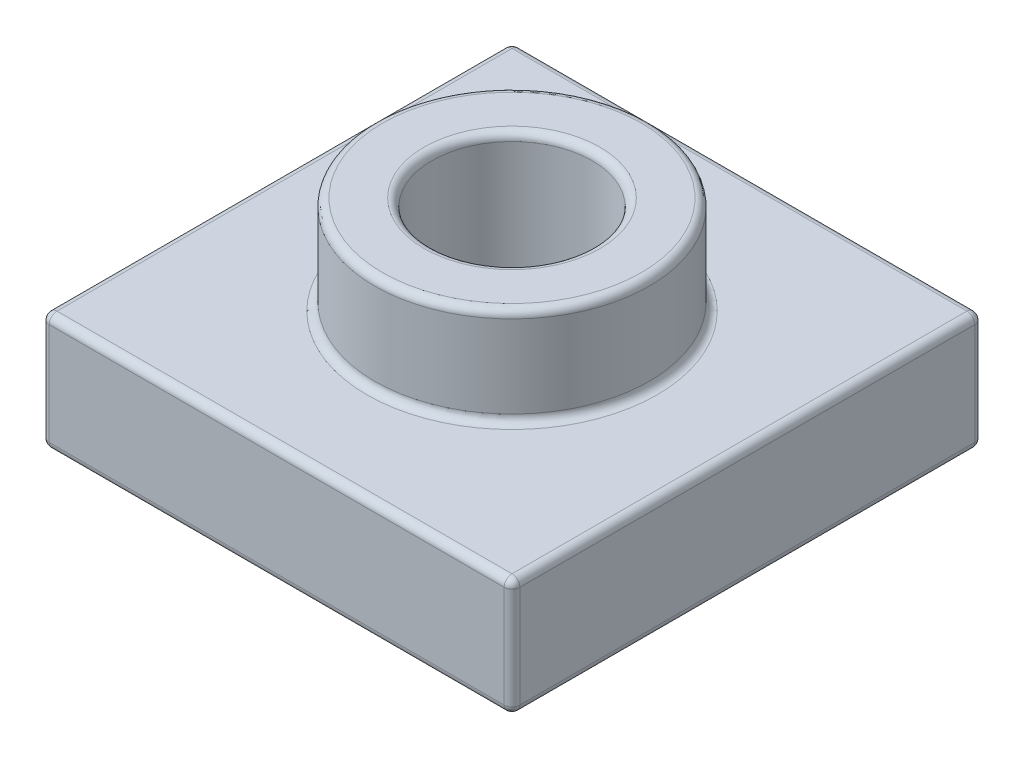
ISO-10303-21;
HEADER;
FILE_DESCRIPTION(('STEP AP214'),'2;1');
FILE_NAME('part.step','',(''),(''),'','','');
FILE_SCHEMA(('AUTOMOTIVE_DESIGN { 1 0 10303 214 1 1 1 1 }'));
ENDSEC;
DATA;
#1=APPLICATION_CONTEXT('core data for automotive mechanical design processes');
#2=APPLICATION_PROTOCOL_DEFINITION('international standard','automotive_design',2000,#1);
#3=PRODUCT_CONTEXT('',#1,'mechanical');
#4=PRODUCT('Part','Part','',(#3));
#5=PRODUCT_RELATED_PRODUCT_CATEGORY('part','',(#4));
#6=PRODUCT_DEFINITION_FORMATION('','',#4);
#7=PRODUCT_DEFINITION_CONTEXT('part definition',#1,'design');
#8=PRODUCT_DEFINITION('design','',#6,#7);
#9=PRODUCT_DEFINITION_SHAPE('','',#8);
#10=(LENGTH_UNIT() NAMED_UNIT(*) SI_UNIT(.MILLI.,.METRE.));
#11=(NAMED_UNIT(*) PLANE_ANGLE_UNIT() SI_UNIT($,.RADIAN.));
#12=(NAMED_UNIT(*) SI_UNIT($,.STERADIAN.) SOLID_ANGLE_UNIT());
#13=UNCERTAINTY_MEASURE_WITH_UNIT(LENGTH_MEASURE(1.E-05),#10,'distance_accuracy_value','');
#14=(GEOMETRIC_REPRESENTATION_CONTEXT(3) GLOBAL_UNCERTAINTY_ASSIGNED_CONTEXT((#13)) GLOBAL_UNIT_ASSIGNED_CONTEXT((#10,
#11,#12)) REPRESENTATION_CONTEXT('',''));
#15=CARTESIAN_POINT('',(0.,0.,0.));
#16=DIRECTION('',(0.,0.,1.));
#17=DIRECTION('',(1.,0.,0.));
#18=AXIS2_PLACEMENT_3D('',#15,#16,#17);
#19=CARTESIAN_POINT('',(60.,30.,-60.));
#20=DIRECTION('',(-1.,0.,0.));
#21=DIRECTION('',(0.,0.,1.));
#22=AXIS2_PLACEMENT_3D('',#19,#20,#21);
#23=PLANE('',#22);
#24=DIRECTION('',(0.,0.,-1.));
#25=VECTOR('',#24,1.);
#26=CARTESIAN_POINT('',(60.,2.,-60.));
#27=LINE('',#26,#25);
#28=CARTESIAN_POINT('',(60.,2.,58.));
#29=VERTEX_POINT('',#28);
#30=CARTESIAN_POINT('',(60.,2.,-58.));
#31=VERTEX_POINT('',#30);
#32=EDGE_CURVE('E219',#29,#31,#27,.T.);
#33=ORIENTED_EDGE('',*,*,#32,.T.);
#34=DIRECTION('',(0.,-1.,0.));
#35=VECTOR('',#34,1.);
#36=CARTESIAN_POINT('',(60.,30.,-58.));
#37=LINE('',#36,#35);
#38=CARTESIAN_POINT('',(60.,28.,-58.));
#39=VERTEX_POINT('',#38);
#40=EDGE_CURVE('E222',#31,#39,#37,.F.);
#41=ORIENTED_EDGE('',*,*,#40,.T.);
#42=DIRECTION('',(0.,0.,-1.));
#43=VECTOR('',#42,1.);
#44=CARTESIAN_POINT('',(60.,28.,60.));
#45=LINE('',#44,#43);
#46=CARTESIAN_POINT('',(60.,28.,58.));
#47=VERTEX_POINT('',#46);
#48=EDGE_CURVE('E217',#39,#47,#45,.F.);
#49=ORIENTED_EDGE('',*,*,#48,.T.);
#50=DIRECTION('',(0.,-1.,0.));
#51=VECTOR('',#50,1.);
#52=CARTESIAN_POINT('',(60.,30.,58.));
#53=LINE('',#52,#51);
#54=EDGE_CURVE('E215',#47,#29,#53,.T.);
#55=ORIENTED_EDGE('',*,*,#54,.T.);
#56=EDGE_LOOP('',(#33,#41,#49,#55));
#57=FACE_BOUND('',#56,.T.);
#58=ADVANCED_FACE('F33',(#57),#23,.F.);
#59=CARTESIAN_POINT('',(-60.,30.,-60.));
#60=DIRECTION('',(0.,0.,1.));
#61=DIRECTION('',(1.,0.,0.));
#62=AXIS2_PLACEMENT_3D('',#59,#60,#61);
#63=PLANE('',#62);
#64=DIRECTION('',(-1.,0.,0.));
#65=VECTOR('',#64,1.);
#66=CARTESIAN_POINT('',(60.,28.,-60.));
#67=LINE('',#66,#65);
#68=CARTESIAN_POINT('',(-58.,28.,-60.));
#69=VERTEX_POINT('',#68);
#70=CARTESIAN_POINT('',(58.,28.,-60.));
#71=VERTEX_POINT('',#70);
#72=EDGE_CURVE('E182',#69,#71,#67,.F.);
#73=ORIENTED_EDGE('',*,*,#72,.T.);
#74=DIRECTION('',(0.,-1.,0.));
#75=VECTOR('',#74,1.);
#76=CARTESIAN_POINT('',(58.,30.,-60.));
#77=LINE('',#76,#75);
#78=CARTESIAN_POINT('',(58.,2.,-60.));
#79=VERTEX_POINT('',#78);
#80=EDGE_CURVE('E187',#71,#79,#77,.T.);
#81=ORIENTED_EDGE('',*,*,#80,.T.);
#82=DIRECTION('',(-1.,0.,0.));
#83=VECTOR('',#82,1.);
#84=CARTESIAN_POINT('',(-60.,2.,-60.));
#85=LINE('',#84,#83);
#86=CARTESIAN_POINT('',(-58.,2.,-60.));
#87=VERTEX_POINT('',#86);
#88=EDGE_CURVE('E184',#79,#87,#85,.T.);
#89=ORIENTED_EDGE('',*,*,#88,.T.);
#90=DIRECTION('',(0.,-1.,0.));
#91=VECTOR('',#90,1.);
#92=CARTESIAN_POINT('',(-58.,30.,-60.));
#93=LINE('',#92,#91);
#94=EDGE_CURVE('E180',#87,#69,#93,.F.);
#95=ORIENTED_EDGE('',*,*,#94,.T.);
#96=EDGE_LOOP('',(#73,#81,#89,#95));
#97=FACE_BOUND('',#96,.T.);
#98=ADVANCED_FACE('F373',(#97),#63,.F.);
#99=CARTESIAN_POINT('',(-60.,30.,-60.));
#100=DIRECTION('',(1.,0.,0.));
#101=DIRECTION('',(0.,0.,-1.));
#102=AXIS2_PLACEMENT_3D('',#99,#100,#101);
#103=PLANE('',#102);
#104=DIRECTION('',(0.,0.,1.));
#105=VECTOR('',#104,1.);
#106=CARTESIAN_POINT('',(-60.,28.,-60.));
#107=LINE('',#106,#105);
#108=CARTESIAN_POINT('',(-60.,28.,58.));
#109=VERTEX_POINT('',#108);
#110=CARTESIAN_POINT('',(-60.,28.,-58.));
#111=VERTEX_POINT('',#110);
#112=EDGE_CURVE('E199',#109,#111,#107,.F.);
#113=ORIENTED_EDGE('',*,*,#112,.T.);
#114=DIRECTION('',(0.,-1.,0.));
#115=VECTOR('',#114,1.);
#116=CARTESIAN_POINT('',(-60.,30.,-58.));
#117=LINE('',#116,#115);
#118=CARTESIAN_POINT('',(-60.,2.,-58.));
#119=VERTEX_POINT('',#118);
#120=EDGE_CURVE('E204',#111,#119,#117,.T.);
#121=ORIENTED_EDGE('',*,*,#120,.T.);
#122=DIRECTION('',(0.,0.,1.));
#123=VECTOR('',#122,1.);
#124=CARTESIAN_POINT('',(-60.,2.,-60.));
#125=LINE('',#124,#123);
#126=CARTESIAN_POINT('',(-60.,2.,58.));
#127=VERTEX_POINT('',#126);
#128=EDGE_CURVE('E201',#119,#127,#125,.T.);
#129=ORIENTED_EDGE('',*,*,#128,.T.);
#130=DIRECTION('',(0.,-1.,0.));
#131=VECTOR('',#130,1.);
#132=CARTESIAN_POINT('',(-60.,30.,58.));
#133=LINE('',#132,#131);
#134=EDGE_CURVE('E197',#127,#109,#133,.F.);
#135=ORIENTED_EDGE('',*,*,#134,.T.);
#136=EDGE_LOOP('',(#113,#121,#129,#135));
#137=FACE_BOUND('',#136,.T.);
#138=ADVANCED_FACE('F385',(#137),#103,.F.);
#139=CARTESIAN_POINT('',(-60.,30.,60.));
#140=DIRECTION('',(0.,0.,-1.));
#141=DIRECTION('',(-1.,0.,0.));
#142=AXIS2_PLACEMENT_3D('',#139,#140,#141);
#143=PLANE('',#142);
#144=DIRECTION('',(1.,0.,0.));
#145=VECTOR('',#144,1.);
#146=CARTESIAN_POINT('',(-60.,2.,60.));
#147=LINE('',#146,#145);
#148=CARTESIAN_POINT('',(-58.,2.,60.));
#149=VERTEX_POINT('',#148);
#150=CARTESIAN_POINT('',(58.,2.,60.));
#151=VERTEX_POINT('',#150);
#152=EDGE_CURVE('E210',#149,#151,#147,.T.);
#153=ORIENTED_EDGE('',*,*,#152,.T.);
#154=DIRECTION('',(0.,-1.,0.));
#155=VECTOR('',#154,1.);
#156=CARTESIAN_POINT('',(58.,30.,60.));
#157=LINE('',#156,#155);
#158=CARTESIAN_POINT('',(58.,28.,60.));
#159=VERTEX_POINT('',#158);
#160=EDGE_CURVE('E213',#151,#159,#157,.F.);
#161=ORIENTED_EDGE('',*,*,#160,.T.);
#162=DIRECTION('',(1.,0.,0.));
#163=VECTOR('',#162,1.);
#164=CARTESIAN_POINT('',(-60.,28.,60.));
#165=LINE('',#164,#163);
#166=CARTESIAN_POINT('',(-58.,28.,60.));
#167=VERTEX_POINT('',#166);
#168=EDGE_CURVE('E208',#159,#167,#165,.F.);
#169=ORIENTED_EDGE('',*,*,#168,.T.);
#170=DIRECTION('',(0.,-1.,0.));
#171=VECTOR('',#170,1.);
#172=CARTESIAN_POINT('',(-58.,30.,60.));
#173=LINE('',#172,#171);
#174=EDGE_CURVE('E206',#167,#149,#173,.T.);
#175=ORIENTED_EDGE('',*,*,#174,.T.);
#176=EDGE_LOOP('',(#153,#161,#169,#175));
#177=FACE_BOUND('',#176,.T.);
#178=ADVANCED_FACE('F356',(#177),#143,.F.);
#179=CARTESIAN_POINT('',(0.,30.,0.));
#180=DIRECTION('',(0.,1.,0.));
#181=DIRECTION('',(0.,0.,1.));
#182=AXIS2_PLACEMENT_3D('',#179,#180,#181);
#183=PLANE('',#182);
#184=CARTESIAN_POINT('',(0.,30.,0.));
#185=DIRECTION('',(0.,1.,0.));
#186=DIRECTION('',(0.,0.,1.));
#187=AXIS2_PLACEMENT_3D('',#184,#185,#186);
#188=CIRCLE('',#187,37.);
#189=CARTESIAN_POINT('',(0.,30.,37.));
#190=VERTEX_POINT('',#189);
#191=EDGE_CURVE('E11',#190,#190,#188,.F.);
#192=ORIENTED_EDGE('',*,*,#191,.T.);
#193=EDGE_LOOP('',(#192));
#194=FACE_BOUND('',#193,.T.);
#195=DIRECTION('',(1.,0.,0.));
#196=VECTOR('',#195,1.);
#197=CARTESIAN_POINT('',(60.,30.,58.));
#198=LINE('',#197,#196);
#199=CARTESIAN_POINT('',(-58.,30.,58.));
#200=VERTEX_POINT('',#199);
#201=CARTESIAN_POINT('',(58.,30.,58.));
#202=VERTEX_POINT('',#201);
#203=EDGE_CURVE('E54',#200,#202,#198,.T.);
#204=ORIENTED_EDGE('',*,*,#203,.T.);
#205=DIRECTION('',(0.,0.,-1.));
#206=VECTOR('',#205,1.);
#207=CARTESIAN_POINT('',(58.,30.,-60.));
#208=LINE('',#207,#206);
#209=CARTESIAN_POINT('',(58.,30.,-58.));
#210=VERTEX_POINT('',#209);
#211=EDGE_CURVE('E42',#202,#210,#208,.T.);
#212=ORIENTED_EDGE('',*,*,#211,.T.);
#213=DIRECTION('',(-1.,0.,0.));
#214=VECTOR('',#213,1.);
#215=CARTESIAN_POINT('',(-60.,30.,-58.));
#216=LINE('',#215,#214);
#217=CARTESIAN_POINT('',(-58.,30.,-58.));
#218=VERTEX_POINT('',#217);
#219=EDGE_CURVE('E245',#210,#218,#216,.T.);
#220=ORIENTED_EDGE('',*,*,#219,.T.);
#221=DIRECTION('',(0.,0.,1.));
#222=VECTOR('',#221,1.);
#223=CARTESIAN_POINT('',(-58.,30.,60.));
#224=LINE('',#223,#222);
#225=EDGE_CURVE('E242',#218,#200,#224,.T.);
#226=ORIENTED_EDGE('',*,*,#225,.T.);
#227=EDGE_LOOP('',(#204,#212,#220,#226));
#228=FACE_BOUND('',#227,.T.);
#229=ADVANCED_FACE('F343',(#194,#228),#183,.T.);
#230=CARTESIAN_POINT('',(0.,55.,0.));
#231=DIRECTION('',(0.,-1.,0.));
#232=DIRECTION('',(0.,0.,-1.));
#233=AXIS2_PLACEMENT_3D('',#230,#231,#232);
#234=CYLINDRICAL_SURFACE('',#233,35.);
#235=CARTESIAN_POINT('',(0.,53.,0.));
#236=DIRECTION('',(0.,1.,0.));
#237=DIRECTION('',(0.,0.,1.));
#238=AXIS2_PLACEMENT_3D('',#235,#236,#237);
#239=CIRCLE('',#238,35.);
#240=CARTESIAN_POINT('',(0.,53.,35.));
#241=VERTEX_POINT('',#240);
#242=EDGE_CURVE('E239',#241,#241,#239,.F.);
#243=ORIENTED_EDGE('',*,*,#242,.T.);
#244=EDGE_LOOP('',(#243));
#245=FACE_BOUND('',#244,.T.);
#246=CARTESIAN_POINT('',(0.,32.,0.));
#247=DIRECTION('',(0.,1.,0.));
#248=DIRECTION('',(0.,0.,1.));
#249=AXIS2_PLACEMENT_3D('',#246,#247,#248);
#250=CIRCLE('',#249,35.);
#251=CARTESIAN_POINT('',(0.,32.,35.));
#252=VERTEX_POINT('',#251);
#253=EDGE_CURVE('E236',#252,#252,#250,.T.);
#254=ORIENTED_EDGE('',*,*,#253,.T.);
#255=EDGE_LOOP('',(#254));
#256=FACE_BOUND('',#255,.T.);
#257=ADVANCED_FACE('F692',(#245,#256),#234,.T.);
#258=CARTESIAN_POINT('',(0.,55.,0.));
#259=DIRECTION('',(0.,1.,0.));
#260=DIRECTION('',(0.,0.,1.));
#261=AXIS2_PLACEMENT_3D('',#258,#259,#260);
#262=PLANE('',#261);
#263=CARTESIAN_POINT('',(0.,55.,0.));
#264=DIRECTION('',(0.,1.,0.));
#265=DIRECTION('',(0.,0.,1.));
#266=AXIS2_PLACEMENT_3D('',#263,#264,#265);
#267=CIRCLE('',#266,33.);
#268=CARTESIAN_POINT('',(0.,55.,33.));
#269=VERTEX_POINT('',#268);
#270=EDGE_CURVE('E233',#269,#269,#267,.T.);
#271=ORIENTED_EDGE('',*,*,#270,.T.);
#272=EDGE_LOOP('',(#271));
#273=FACE_BOUND('',#272,.T.);
#274=CARTESIAN_POINT('',(0.,55.,0.));
#275=DIRECTION('',(0.,1.,0.));
#276=DIRECTION('',(0.,0.,1.));
#277=AXIS2_PLACEMENT_3D('',#274,#275,#276);
#278=CIRCLE('',#277,22.4252107322673);
#279=CARTESIAN_POINT('',(0.,55.,22.4252107322673));
#280=VERTEX_POINT('',#279);
#281=EDGE_CURVE('E230',#280,#280,#278,.F.);
#282=ORIENTED_EDGE('',*,*,#281,.T.);
#283=EDGE_LOOP('',(#282));
#284=FACE_BOUND('',#283,.T.);
#285=ADVANCED_FACE('F683',(#273,#284),#262,.T.);
#286=CARTESIAN_POINT('',(0.,0.,0.));
#287=DIRECTION('',(0.,1.,0.));
#288=DIRECTION('',(0.,0.,1.));
#289=AXIS2_PLACEMENT_3D('',#286,#287,#288);
#290=CYLINDRICAL_SURFACE('',#289,20.4252107322673);
#291=CARTESIAN_POINT('',(0.,2.,0.));
#292=DIRECTION('',(0.,1.,0.));
#293=DIRECTION('',(0.,0.,1.));
#294=AXIS2_PLACEMENT_3D('',#291,#292,#293);
#295=CIRCLE('',#294,20.4252107322673);
#296=CARTESIAN_POINT('',(0.,2.,20.4252107322673));
#297=VERTEX_POINT('',#296);
#298=EDGE_CURVE('E227',#297,#297,#295,.F.);
#299=ORIENTED_EDGE('',*,*,#298,.T.);
#300=EDGE_LOOP('',(#299));
#301=FACE_BOUND('',#300,.T.);
#302=CARTESIAN_POINT('',(0.,53.,0.));
#303=DIRECTION('',(0.,1.,0.));
#304=DIRECTION('',(0.,0.,1.));
#305=AXIS2_PLACEMENT_3D('',#302,#303,#304);
#306=CIRCLE('',#305,20.4252107322673);
#307=CARTESIAN_POINT('',(0.,53.,20.4252107322673));
#308=VERTEX_POINT('',#307);
#309=EDGE_CURVE('E224',#308,#308,#306,.T.);
#310=ORIENTED_EDGE('',*,*,#309,.T.);
#311=EDGE_LOOP('',(#310));
#312=FACE_BOUND('',#311,.T.);
#313=ADVANCED_FACE('F675',(#301,#312),#290,.F.);
#314=CARTESIAN_POINT('',(0.,28.,58.));
#315=DIRECTION('',(-1.,0.,0.));
#316=DIRECTION('',(0.,0.,1.));
#317=AXIS2_PLACEMENT_3D('',#314,#315,#316);
#318=CYLINDRICAL_SURFACE('',#317,2.);
#319=CARTESIAN_POINT('',(58.,28.,58.));
#320=DIRECTION('',(1.,0.,0.));
#321=DIRECTION('',(0.,0.,-1.));
#322=AXIS2_PLACEMENT_3D('',#319,#320,#321);
#323=CIRCLE('',#322,2.);
#324=EDGE_CURVE('E37',#202,#159,#323,.T.);
#325=ORIENTED_EDGE('',*,*,#324,.F.);
#326=ORIENTED_EDGE('',*,*,#203,.F.);
#327=CARTESIAN_POINT('',(-58.,28.,58.));
#328=DIRECTION('',(-1.,0.,0.));
#329=DIRECTION('',(0.,0.,1.));
#330=AXIS2_PLACEMENT_3D('',#327,#328,#329);
#331=CIRCLE('',#330,2.);
#332=EDGE_CURVE('E307',#167,#200,#331,.T.);
#333=ORIENTED_EDGE('',*,*,#332,.F.);
#334=ORIENTED_EDGE('',*,*,#168,.F.);
#335=EDGE_LOOP('',(#325,#326,#333,#334));
#336=FACE_BOUND('',#335,.T.);
#337=ADVANCED_FACE('F346',(#336),#318,.T.);
#338=CARTESIAN_POINT('',(58.,28.,58.));
#339=DIRECTION('',(0.,0.,1.));
#340=DIRECTION('',(1.,0.,0.));
#341=AXIS2_PLACEMENT_3D('',#338,#339,#340);
#342=SPHERICAL_SURFACE('',#341,2.);
#343=CARTESIAN_POINT('',(58.,28.,58.));
#344=DIRECTION('',(0.,0.,1.));
#345=DIRECTION('',(1.,0.,0.));
#346=AXIS2_PLACEMENT_3D('',#343,#344,#345);
#347=CIRCLE('',#346,2.);
#348=EDGE_CURVE('E302',#202,#47,#347,.F.);
#349=ORIENTED_EDGE('',*,*,#348,.F.);
#350=ORIENTED_EDGE('',*,*,#324,.T.);
#351=CARTESIAN_POINT('',(58.,28.,58.));
#352=DIRECTION('',(0.,1.,0.));
#353=DIRECTION('',(0.,0.,1.));
#354=AXIS2_PLACEMENT_3D('',#351,#352,#353);
#355=CIRCLE('',#354,2.);
#356=EDGE_CURVE('E305',#47,#159,#355,.F.);
#357=ORIENTED_EDGE('',*,*,#356,.F.);
#358=EDGE_LOOP('',(#349,#350,#357));
#359=FACE_BOUND('',#358,.T.);
#360=ADVANCED_FACE('F317',(#359),#342,.T.);
#361=CARTESIAN_POINT('',(-58.,28.,58.));
#362=DIRECTION('',(0.,0.,1.));
#363=DIRECTION('',(1.,0.,0.));
#364=AXIS2_PLACEMENT_3D('',#361,#362,#363);
#365=SPHERICAL_SURFACE('',#364,2.);
#366=CARTESIAN_POINT('',(-58.,28.,58.));
#367=DIRECTION('',(0.,1.,0.));
#368=DIRECTION('',(0.,0.,1.));
#369=AXIS2_PLACEMENT_3D('',#366,#367,#368);
#370=CIRCLE('',#369,2.);
#371=EDGE_CURVE('E296',#167,#109,#370,.F.);
#372=ORIENTED_EDGE('',*,*,#371,.F.);
#373=ORIENTED_EDGE('',*,*,#332,.T.);
#374=CARTESIAN_POINT('',(-58.,28.,58.));
#375=DIRECTION('',(0.,0.,1.));
#376=DIRECTION('',(1.,0.,0.));
#377=AXIS2_PLACEMENT_3D('',#374,#375,#376);
#378=CIRCLE('',#377,2.);
#379=EDGE_CURVE('E299',#109,#200,#378,.F.);
#380=ORIENTED_EDGE('',*,*,#379,.F.);
#381=EDGE_LOOP('',(#372,#373,#380));
#382=FACE_BOUND('',#381,.T.);
#383=ADVANCED_FACE('F348',(#382),#365,.T.);
#384=CARTESIAN_POINT('',(58.,30.,58.));
#385=DIRECTION('',(0.,-1.,0.));
#386=DIRECTION('',(0.,0.,-1.));
#387=AXIS2_PLACEMENT_3D('',#384,#385,#386);
#388=CYLINDRICAL_SURFACE('',#387,2.);
#389=ORIENTED_EDGE('',*,*,#356,.T.);
#390=ORIENTED_EDGE('',*,*,#160,.F.);
#391=CARTESIAN_POINT('',(58.,2.,58.));
#392=DIRECTION('',(0.,-1.,0.));
#393=DIRECTION('',(0.,0.,-1.));
#394=AXIS2_PLACEMENT_3D('',#391,#392,#393);
#395=CIRCLE('',#394,2.);
#396=EDGE_CURVE('E291',#29,#151,#395,.T.);
#397=ORIENTED_EDGE('',*,*,#396,.F.);
#398=ORIENTED_EDGE('',*,*,#54,.F.);
#399=EDGE_LOOP('',(#389,#390,#397,#398));
#400=FACE_BOUND('',#399,.T.);
#401=ADVANCED_FACE('F323',(#400),#388,.T.);
#402=CARTESIAN_POINT('',(58.,28.,0.));
#403=DIRECTION('',(0.,0.,1.));
#404=DIRECTION('',(1.,0.,0.));
#405=AXIS2_PLACEMENT_3D('',#402,#403,#404);
#406=CYLINDRICAL_SURFACE('',#405,2.);
#407=ORIENTED_EDGE('',*,*,#348,.T.);
#408=ORIENTED_EDGE('',*,*,#48,.F.);
#409=CARTESIAN_POINT('',(58.,28.,-58.));
#410=DIRECTION('',(0.,0.,-1.));
#411=DIRECTION('',(-1.,0.,0.));
#412=AXIS2_PLACEMENT_3D('',#409,#410,#411);
#413=CIRCLE('',#412,2.);
#414=EDGE_CURVE('E288',#210,#39,#413,.T.);
#415=ORIENTED_EDGE('',*,*,#414,.F.);
#416=ORIENTED_EDGE('',*,*,#211,.F.);
#417=EDGE_LOOP('',(#407,#408,#415,#416));
#418=FACE_BOUND('',#417,.T.);
#419=ADVANCED_FACE('F332',(#418),#406,.T.);
#420=CARTESIAN_POINT('',(0.,28.,-58.));
#421=DIRECTION('',(1.,0.,0.));
#422=DIRECTION('',(0.,0.,-1.));
#423=AXIS2_PLACEMENT_3D('',#420,#421,#422);
#424=CYLINDRICAL_SURFACE('',#423,2.);
#425=CARTESIAN_POINT('',(-58.,28.,-58.));
#426=DIRECTION('',(-1.,0.,0.));
#427=DIRECTION('',(0.,0.,1.));
#428=AXIS2_PLACEMENT_3D('',#425,#426,#427);
#429=CIRCLE('',#428,2.);
#430=EDGE_CURVE('E282',#218,#69,#429,.T.);
#431=ORIENTED_EDGE('',*,*,#430,.F.);
#432=ORIENTED_EDGE('',*,*,#219,.F.);
#433=CARTESIAN_POINT('',(58.,28.,-58.));
#434=DIRECTION('',(1.,0.,0.));
#435=DIRECTION('',(0.,0.,-1.));
#436=AXIS2_PLACEMENT_3D('',#433,#434,#435);
#437=CIRCLE('',#436,2.);
#438=EDGE_CURVE('E285',#71,#210,#437,.T.);
#439=ORIENTED_EDGE('',*,*,#438,.F.);
#440=ORIENTED_EDGE('',*,*,#72,.F.);
#441=EDGE_LOOP('',(#431,#432,#439,#440));
#442=FACE_BOUND('',#441,.T.);
#443=ADVANCED_FACE('F341',(#442),#424,.T.);
#444=CARTESIAN_POINT('',(-58.,28.,0.));
#445=DIRECTION('',(0.,0.,-1.));
#446=DIRECTION('',(-1.,0.,0.));
#447=AXIS2_PLACEMENT_3D('',#444,#445,#446);
#448=CYLINDRICAL_SURFACE('',#447,2.);
#449=ORIENTED_EDGE('',*,*,#379,.T.);
#450=ORIENTED_EDGE('',*,*,#225,.F.);
#451=CARTESIAN_POINT('',(-58.,28.,-58.));
#452=DIRECTION('',(0.,0.,-1.));
#453=DIRECTION('',(-1.,0.,0.));
#454=AXIS2_PLACEMENT_3D('',#451,#452,#453);
#455=CIRCLE('',#454,2.);
#456=EDGE_CURVE('E280',#111,#218,#455,.T.);
#457=ORIENTED_EDGE('',*,*,#456,.F.);
#458=ORIENTED_EDGE('',*,*,#112,.F.);
#459=EDGE_LOOP('',(#449,#450,#457,#458));
#460=FACE_BOUND('',#459,.T.);
#461=ADVANCED_FACE('F383',(#460),#448,.T.);
#462=CARTESIAN_POINT('',(-58.,30.,58.));
#463=DIRECTION('',(0.,-1.,0.));
#464=DIRECTION('',(0.,0.,-1.));
#465=AXIS2_PLACEMENT_3D('',#462,#463,#464);
#466=CYLINDRICAL_SURFACE('',#465,2.);
#467=ORIENTED_EDGE('',*,*,#371,.T.);
#468=ORIENTED_EDGE('',*,*,#134,.F.);
#469=CARTESIAN_POINT('',(-58.,2.,58.));
#470=DIRECTION('',(0.,-1.,0.));
#471=DIRECTION('',(0.,0.,-1.));
#472=AXIS2_PLACEMENT_3D('',#469,#470,#471);
#473=CIRCLE('',#472,2.);
#474=EDGE_CURVE('E277',#149,#127,#473,.T.);
#475=ORIENTED_EDGE('',*,*,#474,.F.);
#476=ORIENTED_EDGE('',*,*,#174,.F.);
#477=EDGE_LOOP('',(#467,#468,#475,#476));
#478=FACE_BOUND('',#477,.T.);
#479=ADVANCED_FACE('F353',(#478),#466,.T.);
#480=CARTESIAN_POINT('',(-60.,2.,58.));
#481=DIRECTION('',(1.,0.,0.));
#482=DIRECTION('',(0.,0.,-1.));
#483=AXIS2_PLACEMENT_3D('',#480,#481,#482);
#484=CYLINDRICAL_SURFACE('',#483,2.);
#485=CARTESIAN_POINT('',(58.,2.,58.));
#486=DIRECTION('',(1.,0.,0.));
#487=DIRECTION('',(0.,0.,-1.));
#488=AXIS2_PLACEMENT_3D('',#485,#486,#487);
#489=CIRCLE('',#488,2.);
#490=CARTESIAN_POINT('',(58.,0.,58.));
#491=VERTEX_POINT('',#490);
#492=EDGE_CURVE('E293',#151,#491,#489,.T.);
#493=ORIENTED_EDGE('',*,*,#492,.F.);
#494=ORIENTED_EDGE('',*,*,#152,.F.);
#495=CARTESIAN_POINT('',(-58.,2.,58.));
#496=DIRECTION('',(-1.,0.,0.));
#497=DIRECTION('',(0.,0.,1.));
#498=AXIS2_PLACEMENT_3D('',#495,#496,#497);
#499=CIRCLE('',#498,2.);
#500=CARTESIAN_POINT('',(-58.,0.,58.));
#501=VERTEX_POINT('',#500);
#502=EDGE_CURVE('E274',#501,#149,#499,.T.);
#503=ORIENTED_EDGE('',*,*,#502,.F.);
#504=DIRECTION('',(1.,0.,0.));
#505=VECTOR('',#504,1.);
#506=CARTESIAN_POINT('',(0.,0.,58.));
#507=LINE('',#506,#505);
#508=EDGE_CURVE('E190',#491,#501,#507,.F.);
#509=ORIENTED_EDGE('',*,*,#508,.F.);
#510=EDGE_LOOP('',(#493,#494,#503,#509));
#511=FACE_BOUND('',#510,.T.);
#512=ADVANCED_FACE('F360',(#511),#484,.T.);
#513=CARTESIAN_POINT('',(58.,2.,58.));
#514=DIRECTION('',(0.,0.,1.));
#515=DIRECTION('',(1.,0.,0.));
#516=AXIS2_PLACEMENT_3D('',#513,#514,#515);
#517=SPHERICAL_SURFACE('',#516,2.);
#518=ORIENTED_EDGE('',*,*,#396,.T.);
#519=ORIENTED_EDGE('',*,*,#492,.T.);
#520=CARTESIAN_POINT('',(58.,2.,58.));
#521=DIRECTION('',(0.,0.,1.));
#522=DIRECTION('',(1.,0.,0.));
#523=AXIS2_PLACEMENT_3D('',#520,#521,#522);
#524=CIRCLE('',#523,2.);
#525=EDGE_CURVE('E271',#29,#491,#524,.F.);
#526=ORIENTED_EDGE('',*,*,#525,.F.);
#527=EDGE_LOOP('',(#518,#519,#526));
#528=FACE_BOUND('',#527,.T.);
#529=ADVANCED_FACE('F363',(#528),#517,.T.);
#530=CARTESIAN_POINT('',(58.,28.,-58.));
#531=DIRECTION('',(0.,0.,1.));
#532=DIRECTION('',(1.,0.,0.));
#533=AXIS2_PLACEMENT_3D('',#530,#531,#532);
#534=SPHERICAL_SURFACE('',#533,2.);
#535=ORIENTED_EDGE('',*,*,#438,.T.);
#536=ORIENTED_EDGE('',*,*,#414,.T.);
#537=CARTESIAN_POINT('',(58.,28.,-58.));
#538=DIRECTION('',(0.,1.,0.));
#539=DIRECTION('',(0.,0.,1.));
#540=AXIS2_PLACEMENT_3D('',#537,#538,#539);
#541=CIRCLE('',#540,2.);
#542=EDGE_CURVE('E268',#71,#39,#541,.F.);
#543=ORIENTED_EDGE('',*,*,#542,.F.);
#544=EDGE_LOOP('',(#535,#536,#543));
#545=FACE_BOUND('',#544,.T.);
#546=ADVANCED_FACE('F336',(#545),#534,.T.);
#547=CARTESIAN_POINT('',(-58.,28.,-58.));
#548=DIRECTION('',(0.,0.,1.));
#549=DIRECTION('',(1.,0.,0.));
#550=AXIS2_PLACEMENT_3D('',#547,#548,#549);
#551=SPHERICAL_SURFACE('',#550,2.);
#552=ORIENTED_EDGE('',*,*,#456,.T.);
#553=ORIENTED_EDGE('',*,*,#430,.T.);
#554=CARTESIAN_POINT('',(-58.,28.,-58.));
#555=DIRECTION('',(0.,1.,0.));
#556=DIRECTION('',(0.,0.,1.));
#557=AXIS2_PLACEMENT_3D('',#554,#555,#556);
#558=CIRCLE('',#557,2.);
#559=EDGE_CURVE('E265',#111,#69,#558,.F.);
#560=ORIENTED_EDGE('',*,*,#559,.F.);
#561=EDGE_LOOP('',(#552,#553,#560));
#562=FACE_BOUND('',#561,.T.);
#563=ADVANCED_FACE('F382',(#562),#551,.T.);
#564=CARTESIAN_POINT('',(-58.,2.,58.));
#565=DIRECTION('',(0.,0.,1.));
#566=DIRECTION('',(1.,0.,0.));
#567=AXIS2_PLACEMENT_3D('',#564,#565,#566);
#568=SPHERICAL_SURFACE('',#567,2.);
#569=ORIENTED_EDGE('',*,*,#502,.T.);
#570=ORIENTED_EDGE('',*,*,#474,.T.);
#571=CARTESIAN_POINT('',(-58.,2.,58.));
#572=DIRECTION('',(0.,0.,1.));
#573=DIRECTION('',(1.,0.,0.));
#574=AXIS2_PLACEMENT_3D('',#571,#572,#573);
#575=CIRCLE('',#574,2.);
#576=EDGE_CURVE('E263',#501,#127,#575,.F.);
#577=ORIENTED_EDGE('',*,*,#576,.F.);
#578=EDGE_LOOP('',(#569,#570,#577));
#579=FACE_BOUND('',#578,.T.);
#580=ADVANCED_FACE('F393',(#579),#568,.T.);
#581=CARTESIAN_POINT('',(58.,2.,-60.));
#582=DIRECTION('',(0.,0.,-1.));
#583=DIRECTION('',(-1.,0.,0.));
#584=AXIS2_PLACEMENT_3D('',#581,#582,#583);
#585=CYLINDRICAL_SURFACE('',#584,2.);
#586=ORIENTED_EDGE('',*,*,#525,.T.);
#587=DIRECTION('',(0.,0.,-1.));
#588=VECTOR('',#587,1.);
#589=CARTESIAN_POINT('',(58.,0.,0.));
#590=LINE('',#589,#588);
#591=CARTESIAN_POINT('',(58.,0.,-58.));
#592=VERTEX_POINT('',#591);
#593=EDGE_CURVE('E150',#592,#491,#590,.F.);
#594=ORIENTED_EDGE('',*,*,#593,.F.);
#595=CARTESIAN_POINT('',(58.,2.,-58.));
#596=DIRECTION('',(0.,0.,-1.));
#597=DIRECTION('',(-1.,0.,0.));
#598=AXIS2_PLACEMENT_3D('',#595,#596,#597);
#599=CIRCLE('',#598,2.);
#600=EDGE_CURVE('E260',#31,#592,#599,.T.);
#601=ORIENTED_EDGE('',*,*,#600,.F.);
#602=ORIENTED_EDGE('',*,*,#32,.F.);
#603=EDGE_LOOP('',(#586,#594,#601,#602));
#604=FACE_BOUND('',#603,.T.);
#605=ADVANCED_FACE('F365',(#604),#585,.T.);
#606=CARTESIAN_POINT('',(58.,30.,-58.));
#607=DIRECTION('',(0.,-1.,0.));
#608=DIRECTION('',(0.,0.,-1.));
#609=AXIS2_PLACEMENT_3D('',#606,#607,#608);
#610=CYLINDRICAL_SURFACE('',#609,2.);
#611=ORIENTED_EDGE('',*,*,#542,.T.);
#612=ORIENTED_EDGE('',*,*,#40,.F.);
#613=CARTESIAN_POINT('',(58.,2.,-58.));
#614=DIRECTION('',(0.,-1.,0.));
#615=DIRECTION('',(0.,0.,-1.));
#616=AXIS2_PLACEMENT_3D('',#613,#614,#615);
#617=CIRCLE('',#616,2.);
#618=EDGE_CURVE('E258',#79,#31,#617,.T.);
#619=ORIENTED_EDGE('',*,*,#618,.F.);
#620=ORIENTED_EDGE('',*,*,#80,.F.);
#621=EDGE_LOOP('',(#611,#612,#619,#620));
#622=FACE_BOUND('',#621,.T.);
#623=ADVANCED_FACE('F371',(#622),#610,.T.);
#624=CARTESIAN_POINT('',(-58.,30.,-58.));
#625=DIRECTION('',(0.,-1.,0.));
#626=DIRECTION('',(0.,0.,-1.));
#627=AXIS2_PLACEMENT_3D('',#624,#625,#626);
#628=CYLINDRICAL_SURFACE('',#627,2.);
#629=ORIENTED_EDGE('',*,*,#559,.T.);
#630=ORIENTED_EDGE('',*,*,#94,.F.);
#631=CARTESIAN_POINT('',(-58.,2.,-58.));
#632=DIRECTION('',(0.,-1.,0.));
#633=DIRECTION('',(0.,0.,-1.));
#634=AXIS2_PLACEMENT_3D('',#631,#632,#633);
#635=CIRCLE('',#634,2.);
#636=EDGE_CURVE('E255',#119,#87,#635,.T.);
#637=ORIENTED_EDGE('',*,*,#636,.F.);
#638=ORIENTED_EDGE('',*,*,#120,.F.);
#639=EDGE_LOOP('',(#629,#630,#637,#638));
#640=FACE_BOUND('',#639,.T.);
#641=ADVANCED_FACE('F378',(#640),#628,.T.);
#642=CARTESIAN_POINT('',(-58.,2.,-60.));
#643=DIRECTION('',(0.,0.,1.));
#644=DIRECTION('',(1.,0.,0.));
#645=AXIS2_PLACEMENT_3D('',#642,#643,#644);
#646=CYLINDRICAL_SURFACE('',#645,2.);
#647=ORIENTED_EDGE('',*,*,#576,.T.);
#648=ORIENTED_EDGE('',*,*,#128,.F.);
#649=CARTESIAN_POINT('',(-58.,2.,-58.));
#650=DIRECTION('',(0.,0.,-1.));
#651=DIRECTION('',(-1.,0.,0.));
#652=AXIS2_PLACEMENT_3D('',#649,#650,#651);
#653=CIRCLE('',#652,2.);
#654=CARTESIAN_POINT('',(-58.,0.,-58.));
#655=VERTEX_POINT('',#654);
#656=EDGE_CURVE('E252',#655,#119,#653,.T.);
#657=ORIENTED_EDGE('',*,*,#656,.F.);
#658=DIRECTION('',(0.,0.,1.));
#659=VECTOR('',#658,1.);
#660=CARTESIAN_POINT('',(-58.,0.,0.));
#661=LINE('',#660,#659);
#662=EDGE_CURVE('E192',#501,#655,#661,.F.);
#663=ORIENTED_EDGE('',*,*,#662,.F.);
#664=EDGE_LOOP('',(#647,#648,#657,#663));
#665=FACE_BOUND('',#664,.T.);
#666=ADVANCED_FACE('F389',(#665),#646,.T.);
#667=CARTESIAN_POINT('',(58.,2.,-58.));
#668=DIRECTION('',(0.,0.,1.));
#669=DIRECTION('',(1.,0.,0.));
#670=AXIS2_PLACEMENT_3D('',#667,#668,#669);
#671=SPHERICAL_SURFACE('',#670,2.);
#672=ORIENTED_EDGE('',*,*,#618,.T.);
#673=ORIENTED_EDGE('',*,*,#600,.T.);
#674=CARTESIAN_POINT('',(58.,2.,-58.));
#675=DIRECTION('',(1.,0.,0.));
#676=DIRECTION('',(0.,0.,-1.));
#677=AXIS2_PLACEMENT_3D('',#674,#675,#676);
#678=CIRCLE('',#677,2.);
#679=EDGE_CURVE('E249',#79,#592,#678,.F.);
#680=ORIENTED_EDGE('',*,*,#679,.F.);
#681=EDGE_LOOP('',(#672,#673,#680));
#682=FACE_BOUND('',#681,.T.);
#683=ADVANCED_FACE('F418',(#682),#671,.T.);
#684=CARTESIAN_POINT('',(-58.,2.,-58.));
#685=DIRECTION('',(0.,0.,1.));
#686=DIRECTION('',(1.,0.,0.));
#687=AXIS2_PLACEMENT_3D('',#684,#685,#686);
#688=SPHERICAL_SURFACE('',#687,2.);
#689=ORIENTED_EDGE('',*,*,#656,.T.);
#690=ORIENTED_EDGE('',*,*,#636,.T.);
#691=CARTESIAN_POINT('',(-58.,2.,-58.));
#692=DIRECTION('',(-1.,0.,0.));
#693=DIRECTION('',(0.,0.,1.));
#694=AXIS2_PLACEMENT_3D('',#691,#692,#693);
#695=CIRCLE('',#694,2.);
#696=EDGE_CURVE('E179',#655,#87,#695,.F.);
#697=ORIENTED_EDGE('',*,*,#696,.F.);
#698=EDGE_LOOP('',(#689,#690,#697));
#699=FACE_BOUND('',#698,.T.);
#700=ADVANCED_FACE('F414',(#699),#688,.T.);
#701=CARTESIAN_POINT('',(-60.,2.,-58.));
#702=DIRECTION('',(-1.,0.,0.));
#703=DIRECTION('',(0.,0.,1.));
#704=AXIS2_PLACEMENT_3D('',#701,#702,#703);
#705=CYLINDRICAL_SURFACE('',#704,2.);
#706=ORIENTED_EDGE('',*,*,#679,.T.);
#707=DIRECTION('',(-1.,0.,0.));
#708=VECTOR('',#707,1.);
#709=CARTESIAN_POINT('',(0.,0.,-58.));
#710=LINE('',#709,#708);
#711=EDGE_CURVE('E194',#655,#592,#710,.F.);
#712=ORIENTED_EDGE('',*,*,#711,.F.);
#713=ORIENTED_EDGE('',*,*,#696,.T.);
#714=ORIENTED_EDGE('',*,*,#88,.F.);
#715=EDGE_LOOP('',(#706,#712,#713,#714));
#716=FACE_BOUND('',#715,.T.);
#717=ADVANCED_FACE('F410',(#716),#705,.T.);
#718=CARTESIAN_POINT('',(0.,2.,0.));
#719=DIRECTION('',(0.,1.,0.));
#720=DIRECTION('',(0.,0.,1.));
#721=AXIS2_PLACEMENT_3D('',#718,#719,#720);
#722=TOROIDAL_SURFACE('',#721,22.4252107322673,2.);
#723=ORIENTED_EDGE('',*,*,#298,.F.);
#724=EDGE_LOOP('',(#723));
#725=FACE_BOUND('',#724,.T.);
#726=CARTESIAN_POINT('',(0.,0.,0.));
#727=DIRECTION('',(0.,1.,0.));
#728=DIRECTION('',(0.,0.,1.));
#729=AXIS2_PLACEMENT_3D('',#726,#727,#728);
#730=CIRCLE('',#729,22.4252107322673);
#731=CARTESIAN_POINT('',(0.,0.,22.4252107322673));
#732=VERTEX_POINT('',#731);
#733=EDGE_CURVE('E168',#732,#732,#730,.T.);
#734=ORIENTED_EDGE('',*,*,#733,.F.);
#735=EDGE_LOOP('',(#734));
#736=FACE_BOUND('',#735,.T.);
#737=ADVANCED_FACE('F413',(#725,#736),#722,.T.);
#738=CARTESIAN_POINT('',(0.,53.,0.));
#739=DIRECTION('',(0.,1.,0.));
#740=DIRECTION('',(0.,0.,1.));
#741=AXIS2_PLACEMENT_3D('',#738,#739,#740);
#742=TOROIDAL_SURFACE('',#741,33.,2.);
#743=ORIENTED_EDGE('',*,*,#242,.F.);
#744=EDGE_LOOP('',(#743));
#745=FACE_BOUND('',#744,.T.);
#746=ORIENTED_EDGE('',*,*,#270,.F.);
#747=EDGE_LOOP('',(#746));
#748=FACE_BOUND('',#747,.T.);
#749=ADVANCED_FACE('F459',(#745,#748),#742,.T.);
#750=CARTESIAN_POINT('',(0.,53.,0.));
#751=DIRECTION('',(0.,1.,0.));
#752=DIRECTION('',(0.,0.,1.));
#753=AXIS2_PLACEMENT_3D('',#750,#751,#752);
#754=TOROIDAL_SURFACE('',#753,22.4252107322673,2.);
#755=ORIENTED_EDGE('',*,*,#281,.F.);
#756=EDGE_LOOP('',(#755));
#757=FACE_BOUND('',#756,.T.);
#758=ORIENTED_EDGE('',*,*,#309,.F.);
#759=EDGE_LOOP('',(#758));
#760=FACE_BOUND('',#759,.T.);
#761=ADVANCED_FACE('F467',(#757,#760),#754,.T.);
#762=CARTESIAN_POINT('',(0.,32.,0.));
#763=DIRECTION('',(0.,1.,0.));
#764=DIRECTION('',(0.,0.,1.));
#765=AXIS2_PLACEMENT_3D('',#762,#763,#764);
#766=TOROIDAL_SURFACE('',#765,37.,2.);
#767=ORIENTED_EDGE('',*,*,#191,.F.);
#768=EDGE_LOOP('',(#767));
#769=FACE_BOUND('',#768,.T.);
#770=ORIENTED_EDGE('',*,*,#253,.F.);
#771=EDGE_LOOP('',(#770));
#772=FACE_BOUND('',#771,.T.);
#773=ADVANCED_FACE('F35',(#769,#772),#766,.F.);
#774=CARTESIAN_POINT('',(58.,30.,-60.));
#775=DIRECTION('',(-1.,0.,0.));
#776=DIRECTION('',(0.,0.,1.));
#777=AXIS2_PLACEMENT_3D('',#774,#775,#776);
#778=PLANE('',#777);
#779=ORIENTED_EDGE('',*,*,#593,.T.);
#780=DIRECTION('',(0.,1.,0.));
#781=VECTOR('',#780,1.);
#782=CARTESIAN_POINT('',(58.,30.,58.));
#783=LINE('',#782,#781);
#784=CARTESIAN_POINT('',(58.,28.,58.));
#785=VERTEX_POINT('',#784);
#786=EDGE_CURVE('E145',#491,#785,#783,.T.);
#787=ORIENTED_EDGE('',*,*,#786,.T.);
#788=DIRECTION('',(0.,0.,1.));
#789=VECTOR('',#788,1.);
#790=CARTESIAN_POINT('',(58.,28.,0.));
#791=LINE('',#790,#789);
#792=CARTESIAN_POINT('',(58.,28.,-58.));
#793=VERTEX_POINT('',#792);
#794=EDGE_CURVE('E135',#793,#785,#791,.T.);
#795=ORIENTED_EDGE('',*,*,#794,.F.);
#796=DIRECTION('',(0.,1.,0.));
#797=VECTOR('',#796,1.);
#798=CARTESIAN_POINT('',(58.,30.,-58.));
#799=LINE('',#798,#797);
#800=EDGE_CURVE('E144',#592,#793,#799,.T.);
#801=ORIENTED_EDGE('',*,*,#800,.F.);
#802=EDGE_LOOP('',(#779,#787,#795,#801));
#803=FACE_BOUND('',#802,.T.);
#804=ADVANCED_FACE('F148',(#803),#778,.T.);
#805=CARTESIAN_POINT('',(-60.,30.,-58.));
#806=DIRECTION('',(0.,0.,1.));
#807=DIRECTION('',(1.,0.,0.));
#808=AXIS2_PLACEMENT_3D('',#805,#806,#807);
#809=PLANE('',#808);
#810=DIRECTION('',(-1.,0.,0.));
#811=VECTOR('',#810,1.);
#812=CARTESIAN_POINT('',(-60.,28.,-58.));
#813=LINE('',#812,#811);
#814=CARTESIAN_POINT('',(-58.,28.,-58.));
#815=VERTEX_POINT('',#814);
#816=EDGE_CURVE('E141',#793,#815,#813,.T.);
#817=ORIENTED_EDGE('',*,*,#816,.T.);
#818=DIRECTION('',(0.,1.,0.));
#819=VECTOR('',#818,1.);
#820=CARTESIAN_POINT('',(-58.,30.,-58.));
#821=LINE('',#820,#819);
#822=EDGE_CURVE('E777',#655,#815,#821,.T.);
#823=ORIENTED_EDGE('',*,*,#822,.F.);
#824=ORIENTED_EDGE('',*,*,#711,.T.);
#825=ORIENTED_EDGE('',*,*,#800,.T.);
#826=EDGE_LOOP('',(#817,#823,#824,#825));
#827=FACE_BOUND('',#826,.T.);
#828=ADVANCED_FACE('F487',(#827),#809,.T.);
#829=CARTESIAN_POINT('',(-58.,30.,-60.));
#830=DIRECTION('',(1.,0.,0.));
#831=DIRECTION('',(0.,0.,-1.));
#832=AXIS2_PLACEMENT_3D('',#829,#830,#831);
#833=PLANE('',#832);
#834=DIRECTION('',(0.,0.,1.));
#835=VECTOR('',#834,1.);
#836=CARTESIAN_POINT('',(-58.,28.,-60.));
#837=LINE('',#836,#835);
#838=CARTESIAN_POINT('',(-58.,28.,58.));
#839=VERTEX_POINT('',#838);
#840=EDGE_CURVE('E158',#815,#839,#837,.T.);
#841=ORIENTED_EDGE('',*,*,#840,.T.);
#842=DIRECTION('',(0.,1.,0.));
#843=VECTOR('',#842,1.);
#844=CARTESIAN_POINT('',(-58.,30.,58.));
#845=LINE('',#844,#843);
#846=EDGE_CURVE('E153',#501,#839,#845,.T.);
#847=ORIENTED_EDGE('',*,*,#846,.F.);
#848=ORIENTED_EDGE('',*,*,#662,.T.);
#849=ORIENTED_EDGE('',*,*,#822,.T.);
#850=EDGE_LOOP('',(#841,#847,#848,#849));
#851=FACE_BOUND('',#850,.T.);
#852=ADVANCED_FACE('F494',(#851),#833,.T.);
#853=CARTESIAN_POINT('',(-60.,30.,58.));
#854=DIRECTION('',(0.,0.,-1.));
#855=DIRECTION('',(-1.,0.,0.));
#856=AXIS2_PLACEMENT_3D('',#853,#854,#855);
#857=PLANE('',#856);
#858=ORIENTED_EDGE('',*,*,#508,.T.);
#859=ORIENTED_EDGE('',*,*,#846,.T.);
#860=DIRECTION('',(1.,0.,0.));
#861=VECTOR('',#860,1.);
#862=CARTESIAN_POINT('',(-60.,28.,58.));
#863=LINE('',#862,#861);
#864=EDGE_CURVE('E139',#839,#785,#863,.T.);
#865=ORIENTED_EDGE('',*,*,#864,.T.);
#866=ORIENTED_EDGE('',*,*,#786,.F.);
#867=EDGE_LOOP('',(#858,#859,#865,#866));
#868=FACE_BOUND('',#867,.T.);
#869=ADVANCED_FACE('F155',(#868),#857,.T.);
#870=CARTESIAN_POINT('',(0.,28.,0.));
#871=DIRECTION('',(0.,1.,0.));
#872=DIRECTION('',(0.,0.,1.));
#873=AXIS2_PLACEMENT_3D('',#870,#871,#872);
#874=PLANE('',#873);
#875=CARTESIAN_POINT('',(0.,28.,0.));
#876=DIRECTION('',(0.,1.,0.));
#877=DIRECTION('',(0.,0.,1.));
#878=AXIS2_PLACEMENT_3D('',#875,#876,#877);
#879=CIRCLE('',#878,37.);
#880=CARTESIAN_POINT('',(0.,28.,37.));
#881=VERTEX_POINT('',#880);
#882=EDGE_CURVE('E160',#881,#881,#879,.F.);
#883=ORIENTED_EDGE('',*,*,#882,.F.);
#884=EDGE_LOOP('',(#883));
#885=FACE_BOUND('',#884,.T.);
#886=ORIENTED_EDGE('',*,*,#864,.F.);
#887=ORIENTED_EDGE('',*,*,#840,.F.);
#888=ORIENTED_EDGE('',*,*,#816,.F.);
#889=ORIENTED_EDGE('',*,*,#794,.T.);
#890=EDGE_LOOP('',(#886,#887,#888,#889));
#891=FACE_BOUND('',#890,.T.);
#892=ADVANCED_FACE('F137',(#885,#891),#874,.F.);
#893=CARTESIAN_POINT('',(0.,55.,0.));
#894=DIRECTION('',(0.,-1.,0.));
#895=DIRECTION('',(0.,0.,-1.));
#896=AXIS2_PLACEMENT_3D('',#893,#894,#895);
#897=CYLINDRICAL_SURFACE('',#896,33.);
#898=CARTESIAN_POINT('',(0.,53.,0.));
#899=DIRECTION('',(0.,1.,0.));
#900=DIRECTION('',(0.,0.,1.));
#901=AXIS2_PLACEMENT_3D('',#898,#899,#900);
#902=CIRCLE('',#901,33.);
#903=CARTESIAN_POINT('',(0.,53.,33.));
#904=VERTEX_POINT('',#903);
#905=EDGE_CURVE('E171',#904,#904,#902,.T.);
#906=ORIENTED_EDGE('',*,*,#905,.T.);
#907=EDGE_LOOP('',(#906));
#908=FACE_BOUND('',#907,.T.);
#909=CARTESIAN_POINT('',(0.,32.,0.));
#910=DIRECTION('',(0.,-1.,0.));
#911=DIRECTION('',(0.,0.,-1.));
#912=AXIS2_PLACEMENT_3D('',#909,#910,#911);
#913=CIRCLE('',#912,33.);
#914=CARTESIAN_POINT('',(0.,32.,-33.));
#915=VERTEX_POINT('',#914);
#916=EDGE_CURVE('E162',#915,#915,#913,.F.);
#917=ORIENTED_EDGE('',*,*,#916,.F.);
#918=EDGE_LOOP('',(#917));
#919=FACE_BOUND('',#918,.T.);
#920=ADVANCED_FACE('F515',(#908,#919),#897,.F.);
#921=CARTESIAN_POINT('',(0.,53.,0.));
#922=DIRECTION('',(0.,1.,0.));
#923=DIRECTION('',(0.,0.,1.));
#924=AXIS2_PLACEMENT_3D('',#921,#922,#923);
#925=PLANE('',#924);
#926=ORIENTED_EDGE('',*,*,#905,.F.);
#927=EDGE_LOOP('',(#926));
#928=FACE_BOUND('',#927,.T.);
#929=CARTESIAN_POINT('',(0.,53.,0.));
#930=DIRECTION('',(0.,1.,0.));
#931=DIRECTION('',(0.,0.,1.));
#932=AXIS2_PLACEMENT_3D('',#929,#930,#931);
#933=CIRCLE('',#932,22.4252107322673);
#934=CARTESIAN_POINT('',(0.,53.,22.4252107322673));
#935=VERTEX_POINT('',#934);
#936=EDGE_CURVE('E174',#935,#935,#933,.T.);
#937=ORIENTED_EDGE('',*,*,#936,.T.);
#938=EDGE_LOOP('',(#937));
#939=FACE_BOUND('',#938,.T.);
#940=ADVANCED_FACE('F523',(#928,#939),#925,.F.);
#941=CARTESIAN_POINT('',(0.,0.,0.));
#942=DIRECTION('',(0.,1.,0.));
#943=DIRECTION('',(0.,0.,1.));
#944=AXIS2_PLACEMENT_3D('',#941,#942,#943);
#945=CYLINDRICAL_SURFACE('',#944,22.4252107322673);
#946=ORIENTED_EDGE('',*,*,#733,.T.);
#947=EDGE_LOOP('',(#946));
#948=FACE_BOUND('',#947,.T.);
#949=ORIENTED_EDGE('',*,*,#936,.F.);
#950=EDGE_LOOP('',(#949));
#951=FACE_BOUND('',#950,.T.);
#952=ADVANCED_FACE('F531',(#948,#951),#945,.T.);
#953=CARTESIAN_POINT('',(0.,32.,0.));
#954=DIRECTION('',(0.,1.,0.));
#955=DIRECTION('',(0.,0.,1.));
#956=AXIS2_PLACEMENT_3D('',#953,#954,#955);
#957=TOROIDAL_SURFACE('',#956,37.,4.);
#958=ORIENTED_EDGE('',*,*,#882,.T.);
#959=EDGE_LOOP('',(#958));
#960=FACE_BOUND('',#959,.T.);
#961=ORIENTED_EDGE('',*,*,#916,.T.);
#962=EDGE_LOOP('',(#961));
#963=FACE_BOUND('',#962,.T.);
#964=ADVANCED_FACE('F539',(#960,#963),#957,.T.);
#965=CLOSED_SHELL('',(#58,#98,#138,#178,#229,#257,#285,#313,#337,#360,#383,#401,#419,#443,#461,
#479,#512,#529,#546,#563,#580,#605,#623,#641,#666,#683,#700,#717,#737,#749,#761,#773,#804,#828,
#852,#869,#892,#920,#940,#952,#964));
#966=MANIFOLD_SOLID_BREP('B2',#965);
#967=ADVANCED_BREP_SHAPE_REPRESENTATION('',(#18,#966),#14);
#968=SHAPE_DEFINITION_REPRESENTATION(#9,#967);
ENDSEC;
END-ISO-10303-21;
